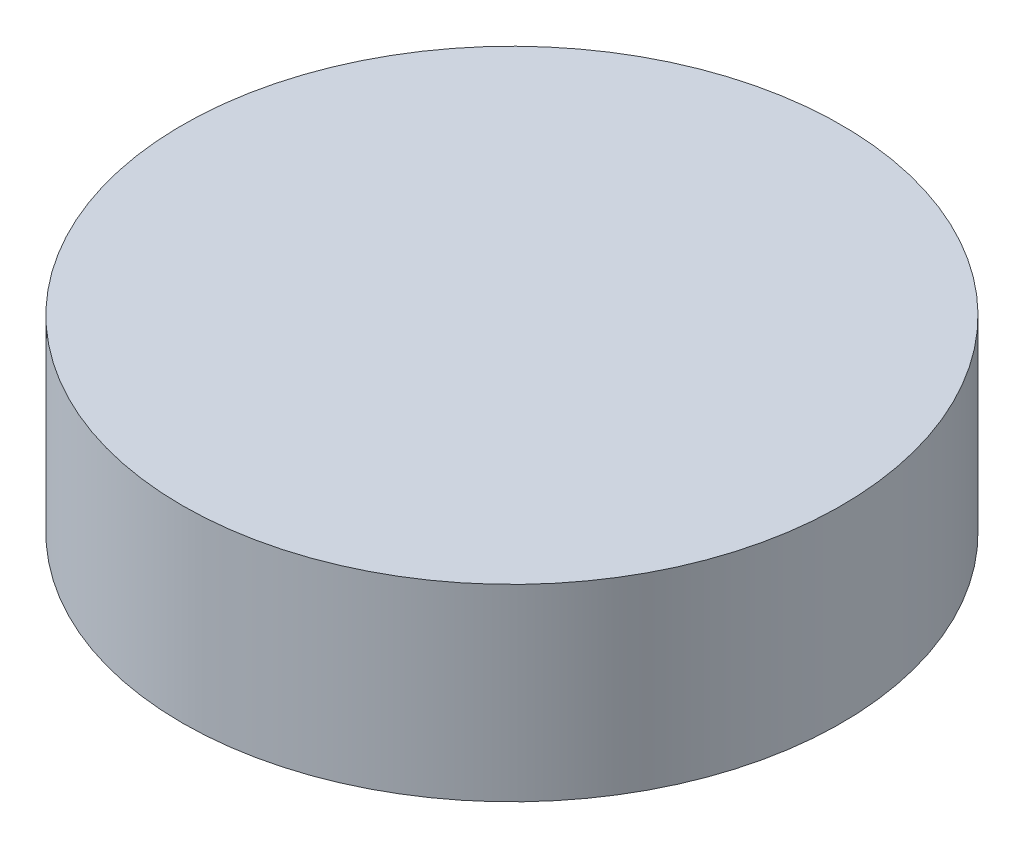
ISO-10303-21;
HEADER;
FILE_DESCRIPTION(('STEP AP214'),'2;1');
FILE_NAME('part.step','',(''),(''),'','','');
FILE_SCHEMA(('AUTOMOTIVE_DESIGN { 1 0 10303 214 1 1 1 1 }'));
ENDSEC;
DATA;
#1=APPLICATION_CONTEXT('core data for automotive mechanical design processes');
#2=APPLICATION_PROTOCOL_DEFINITION('international standard','automotive_design',2000,#1);
#3=PRODUCT_CONTEXT('',#1,'mechanical');
#4=PRODUCT('Part','Part','',(#3));
#5=PRODUCT_RELATED_PRODUCT_CATEGORY('part','',(#4));
#6=PRODUCT_DEFINITION_FORMATION('','',#4);
#7=PRODUCT_DEFINITION_CONTEXT('part definition',#1,'design');
#8=PRODUCT_DEFINITION('design','',#6,#7);
#9=PRODUCT_DEFINITION_SHAPE('','',#8);
#10=(LENGTH_UNIT() NAMED_UNIT(*) SI_UNIT(.MILLI.,.METRE.));
#11=(NAMED_UNIT(*) PLANE_ANGLE_UNIT() SI_UNIT($,.RADIAN.));
#12=(NAMED_UNIT(*) SI_UNIT($,.STERADIAN.) SOLID_ANGLE_UNIT());
#13=UNCERTAINTY_MEASURE_WITH_UNIT(LENGTH_MEASURE(1.E-05),#10,'distance_accuracy_value','');
#14=(GEOMETRIC_REPRESENTATION_CONTEXT(3) GLOBAL_UNCERTAINTY_ASSIGNED_CONTEXT((#13)) GLOBAL_UNIT_ASSIGNED_CONTEXT((#10,
#11,#12)) REPRESENTATION_CONTEXT('',''));
#15=CARTESIAN_POINT('',(0.,0.,0.));
#16=DIRECTION('',(0.,0.,1.));
#17=DIRECTION('',(1.,0.,0.));
#18=AXIS2_PLACEMENT_3D('',#15,#16,#17);
#19=CARTESIAN_POINT('',(0.,2.,0.));
#20=DIRECTION('',(0.,-1.,0.));
#21=DIRECTION('',(0.,0.,-1.));
#22=AXIS2_PLACEMENT_3D('',#19,#20,#21);
#23=CYLINDRICAL_SURFACE('',#22,3.5);
#24=CARTESIAN_POINT('',(0.,2.,0.));
#25=DIRECTION('',(0.,1.,0.));
#26=DIRECTION('',(0.,0.,1.));
#27=AXIS2_PLACEMENT_3D('',#24,#25,#26);
#28=CIRCLE('',#27,3.5);
#29=CARTESIAN_POINT('',(0.,2.,3.5));
#30=VERTEX_POINT('',#29);
#31=EDGE_CURVE('E10',#30,#30,#28,.T.);
#32=ORIENTED_EDGE('',*,*,#31,.F.);
#33=EDGE_LOOP('',(#32));
#34=FACE_BOUND('',#33,.T.);
#35=CARTESIAN_POINT('',(0.,0.,0.));
#36=DIRECTION('',(0.,1.,0.));
#37=DIRECTION('',(0.,0.,1.));
#38=AXIS2_PLACEMENT_3D('',#35,#36,#37);
#39=CIRCLE('',#38,3.5);
#40=CARTESIAN_POINT('',(0.,0.,3.5));
#41=VERTEX_POINT('',#40);
#42=EDGE_CURVE('E36',#41,#41,#39,.T.);
#43=ORIENTED_EDGE('',*,*,#42,.T.);
#44=EDGE_LOOP('',(#43));
#45=FACE_BOUND('',#44,.T.);
#46=ADVANCED_FACE('F33',(#34,#45),#23,.T.);
#47=CARTESIAN_POINT('',(0.,2.,0.));
#48=DIRECTION('',(0.,1.,0.));
#49=DIRECTION('',(0.,0.,1.));
#50=AXIS2_PLACEMENT_3D('',#47,#48,#49);
#51=PLANE('',#50);
#52=ORIENTED_EDGE('',*,*,#31,.T.);
#53=EDGE_LOOP('',(#52));
#54=FACE_BOUND('',#53,.T.);
#55=ADVANCED_FACE('F48',(#54),#51,.T.);
#56=CARTESIAN_POINT('',(0.,0.,0.));
#57=DIRECTION('',(0.,1.,0.));
#58=DIRECTION('',(0.,0.,1.));
#59=AXIS2_PLACEMENT_3D('',#56,#57,#58);
#60=PLANE('',#59);
#61=ORIENTED_EDGE('',*,*,#42,.F.);
#62=EDGE_LOOP('',(#61));
#63=FACE_BOUND('',#62,.T.);
#64=ADVANCED_FACE('F46',(#63),#60,.F.);
#65=CLOSED_SHELL('',(#46,#55,#64));
#66=MANIFOLD_SOLID_BREP('B2',#65);
#67=ADVANCED_BREP_SHAPE_REPRESENTATION('',(#18,#66),#14);
#68=SHAPE_DEFINITION_REPRESENTATION(#9,#67);
ENDSEC;
END-ISO-10303-21;
